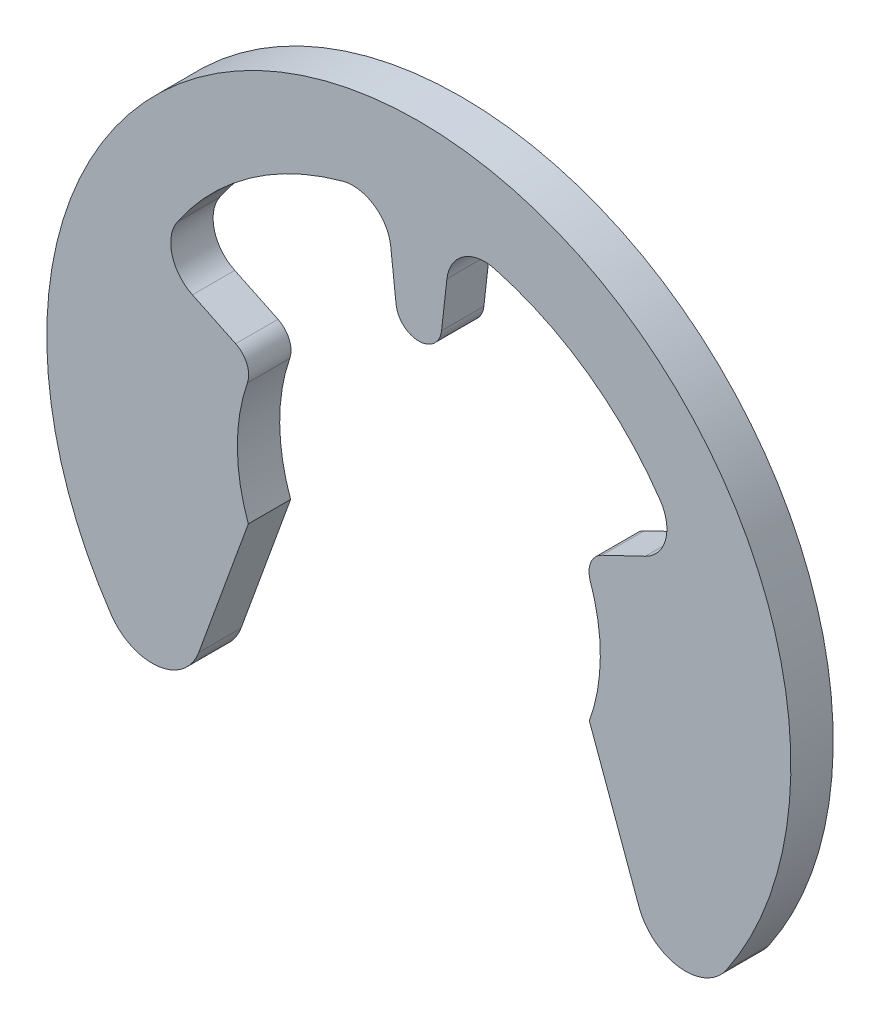
ISO-10303-21;
HEADER;
FILE_DESCRIPTION(('STEP AP214'),'2;1');
FILE_NAME('part.step','',(''),(''),'','','');
FILE_SCHEMA(('AUTOMOTIVE_DESIGN { 1 0 10303 214 1 1 1 1 }'));
ENDSEC;
DATA;
#1=APPLICATION_CONTEXT('core data for automotive mechanical design processes');
#2=APPLICATION_PROTOCOL_DEFINITION('international standard','automotive_design',2000,#1);
#3=PRODUCT_CONTEXT('',#1,'mechanical');
#4=PRODUCT('Part','Part','',(#3));
#5=PRODUCT_RELATED_PRODUCT_CATEGORY('part','',(#4));
#6=PRODUCT_DEFINITION_FORMATION('','',#4);
#7=PRODUCT_DEFINITION_CONTEXT('part definition',#1,'design');
#8=PRODUCT_DEFINITION('design','',#6,#7);
#9=PRODUCT_DEFINITION_SHAPE('','',#8);
#10=(LENGTH_UNIT() NAMED_UNIT(*) SI_UNIT(.MILLI.,.METRE.));
#11=(NAMED_UNIT(*) PLANE_ANGLE_UNIT() SI_UNIT($,.RADIAN.));
#12=(NAMED_UNIT(*) SI_UNIT($,.STERADIAN.) SOLID_ANGLE_UNIT());
#13=UNCERTAINTY_MEASURE_WITH_UNIT(LENGTH_MEASURE(1.E-05),#10,'distance_accuracy_value','');
#14=(GEOMETRIC_REPRESENTATION_CONTEXT(3) GLOBAL_UNCERTAINTY_ASSIGNED_CONTEXT((#13)) GLOBAL_UNIT_ASSIGNED_CONTEXT((#10,
#11,#12)) REPRESENTATION_CONTEXT('',''));
#15=CARTESIAN_POINT('',(0.,0.,0.));
#16=DIRECTION('',(0.,0.,1.));
#17=DIRECTION('',(1.,0.,0.));
#18=AXIS2_PLACEMENT_3D('',#15,#16,#17);
#19=CARTESIAN_POINT('',(0.,0.,0.7));
#20=DIRECTION('',(0.,0.,1.));
#21=DIRECTION('',(1.,0.,0.));
#22=AXIS2_PLACEMENT_3D('',#19,#20,#21);
#23=PLANE('',#22);
#24=DIRECTION('',(-0.342020143325669,-0.939692620785908,0.));
#25=VECTOR('',#24,1.);
#26=CARTESIAN_POINT('',(-2.69420739837844,-0.682981649837103,0.7));
#27=LINE('',#26,#25);
#28=CARTESIAN_POINT('',(-2.81907786235773,-1.02606042997701,0.7));
#29=VERTEX_POINT('',#28);
#30=CARTESIAN_POINT('',(-3.63867386879831,-3.27788195074771,0.7));
#31=VERTEX_POINT('',#30);
#32=EDGE_CURVE('E174',#29,#31,#27,.T.);
#33=ORIENTED_EDGE('',*,*,#32,.F.);
#34=CARTESIAN_POINT('',(0.,0.,0.7));
#35=DIRECTION('',(0.,0.,-1.));
#36=DIRECTION('',(0.81487612668362,-0.579635142275812,0.));
#37=AXIS2_PLACEMENT_3D('',#34,#35,#36);
#38=CIRCLE('',#37,3.);
#39=CARTESIAN_POINT('',(-2.83398503776454,0.984138611033397,0.7));
#40=VERTEX_POINT('',#39);
#41=EDGE_CURVE('E255',#29,#40,#38,.T.);
#42=ORIENTED_EDGE('',*,*,#41,.T.);
#43=CARTESIAN_POINT('',(-3.19106715252287,1.10814007602361,0.7));
#44=DIRECTION('',(0.,0.,1.));
#45=DIRECTION('',(0.81487612668362,0.579635142275812,0.));
#46=AXIS2_PLACEMENT_3D('',#43,#44,#45);
#47=CIRCLE('',#46,0.378);
#48=CARTESIAN_POINT('',(-3.02788681066963,1.44910367530169,0.7));
#49=VERTEX_POINT('',#48);
#50=EDGE_CURVE('E212',#40,#49,#47,.T.);
#51=ORIENTED_EDGE('',*,*,#50,.T.);
#52=DIRECTION('',(-0.902020103910265,0.431694026066745,0.));
#53=VECTOR('',#52,1.);
#54=CARTESIAN_POINT('',(-1.69269281799503,0.810098770888632,0.7));
#55=LINE('',#54,#53);
#56=CARTESIAN_POINT('',(-3.7428844613105,1.79129140825284,0.7));
#57=VERTEX_POINT('',#56);
#58=EDGE_CURVE('E248',#49,#57,#55,.T.);
#59=ORIENTED_EDGE('',*,*,#58,.T.);
#60=CARTESIAN_POINT('',(-3.47091722488845,2.3595640737163,0.7));
#61=DIRECTION('',(0.,0.,-1.));
#62=DIRECTION('',(0.81487612668362,0.579635142275812,0.));
#63=AXIS2_PLACEMENT_3D('',#60,#61,#62);
#64=CIRCLE('',#63,0.63);
#65=CARTESIAN_POINT('',(-3.99192695843139,2.71375167591818,0.7));
#66=VERTEX_POINT('',#65);
#67=EDGE_CURVE('E229',#57,#66,#64,.T.);
#68=ORIENTED_EDGE('',*,*,#67,.T.);
#69=CARTESIAN_POINT('',(0.,0.,0.7));
#70=DIRECTION('',(0.,0.,-1.));
#71=DIRECTION('',(0.81487612668362,0.579635142275812,0.));
#72=AXIS2_PLACEMENT_3D('',#69,#70,#71);
#73=CIRCLE('',#72,4.827);
#74=CARTESIAN_POINT('',(-1.25404073118104,4.6612563590237,0.7));
#75=VERTEX_POINT('',#74);
#76=EDGE_CURVE('E151',#66,#75,#73,.T.);
#77=ORIENTED_EDGE('',*,*,#76,.T.);
#78=CARTESIAN_POINT('',(-1.09036854128171,4.05288853093484,0.7));
#79=DIRECTION('',(0.,0.,-1.));
#80=DIRECTION('',(0.81487612668362,0.579635142275812,0.));
#81=AXIS2_PLACEMENT_3D('',#78,#79,#80);
#82=CIRCLE('',#81,0.63);
#83=CARTESIAN_POINT('',(-0.46432531141737,4.12338586663645,0.7));
#84=VERTEX_POINT('',#83);
#85=EDGE_CURVE('E144',#75,#84,#82,.T.);
#86=ORIENTED_EDGE('',*,*,#85,.T.);
#87=DIRECTION('',(0.11190053285968,-0.993719412483081,0.));
#88=VECTOR('',#87,1.);
#89=CARTESIAN_POINT('',(-0.209987812333993,1.86477186630387,0.7));
#90=LINE('',#89,#88);
#91=CARTESIAN_POINT('',(-0.375625937918604,3.33570159857904,0.7));
#92=VERTEX_POINT('',#91);
#93=EDGE_CURVE('E148',#84,#92,#90,.T.);
#94=ORIENTED_EDGE('',*,*,#93,.T.);
#95=CARTESIAN_POINT('',(0.,3.378,0.7));
#96=DIRECTION('',(0.,0.,1.));
#97=DIRECTION('',(0.81487612668362,-0.579635142275812,0.));
#98=AXIS2_PLACEMENT_3D('',#95,#96,#97);
#99=CIRCLE('',#98,0.378);
#100=CARTESIAN_POINT('',(0.375625937918605,3.33570159857904,0.7));
#101=VERTEX_POINT('',#100);
#102=EDGE_CURVE('E234',#92,#101,#99,.T.);
#103=ORIENTED_EDGE('',*,*,#102,.T.);
#104=DIRECTION('',(0.11190053285968,0.993719412483081,0.));
#105=VECTOR('',#104,1.);
#106=CARTESIAN_POINT('',(0.209987812333994,1.86477186630387,0.7));
#107=LINE('',#106,#105);
#108=CARTESIAN_POINT('',(0.464325311417368,4.12338586663644,0.7));
#109=VERTEX_POINT('',#108);
#110=EDGE_CURVE('E235',#101,#109,#107,.T.);
#111=ORIENTED_EDGE('',*,*,#110,.T.);
#112=CARTESIAN_POINT('',(1.09036854128171,4.05288853093484,0.7));
#113=DIRECTION('',(0.,0.,-1.));
#114=DIRECTION('',(0.81487612668362,-0.579635142275812,0.));
#115=AXIS2_PLACEMENT_3D('',#112,#113,#114);
#116=CIRCLE('',#115,0.63);
#117=CARTESIAN_POINT('',(1.25404073118104,4.6612563590237,0.7));
#118=VERTEX_POINT('',#117);
#119=EDGE_CURVE('E202',#109,#118,#116,.T.);
#120=ORIENTED_EDGE('',*,*,#119,.T.);
#121=CARTESIAN_POINT('',(0.,0.,0.7));
#122=DIRECTION('',(0.,0.,-1.));
#123=DIRECTION('',(0.81487612668362,-0.579635142275812,0.));
#124=AXIS2_PLACEMENT_3D('',#121,#122,#123);
#125=CIRCLE('',#124,4.827);
#126=CARTESIAN_POINT('',(3.99192695843139,2.71375167591818,0.7));
#127=VERTEX_POINT('',#126);
#128=EDGE_CURVE('E189',#118,#127,#125,.T.);
#129=ORIENTED_EDGE('',*,*,#128,.T.);
#130=CARTESIAN_POINT('',(3.47091722488845,2.3595640737163,0.7));
#131=DIRECTION('',(0.,0.,-1.));
#132=DIRECTION('',(0.81487612668362,-0.579635142275812,0.));
#133=AXIS2_PLACEMENT_3D('',#130,#131,#132);
#134=CIRCLE('',#133,0.63);
#135=CARTESIAN_POINT('',(3.7428844613105,1.79129140825284,0.7));
#136=VERTEX_POINT('',#135);
#137=EDGE_CURVE('E190',#127,#136,#134,.T.);
#138=ORIENTED_EDGE('',*,*,#137,.T.);
#139=DIRECTION('',(-0.902020103910264,-0.431694026066746,0.));
#140=VECTOR('',#139,1.);
#141=CARTESIAN_POINT('',(1.69269281799503,0.810098770888631,0.7));
#142=LINE('',#141,#140);
#143=CARTESIAN_POINT('',(3.02788681066963,1.44910367530169,0.7));
#144=VERTEX_POINT('',#143);
#145=EDGE_CURVE('E223',#136,#144,#142,.T.);
#146=ORIENTED_EDGE('',*,*,#145,.T.);
#147=CARTESIAN_POINT('',(3.19106715252287,1.10814007602361,0.7));
#148=DIRECTION('',(0.,0.,1.));
#149=DIRECTION('',(0.81487612668362,-0.579635142275812,0.));
#150=AXIS2_PLACEMENT_3D('',#147,#148,#149);
#151=CIRCLE('',#150,0.378);
#152=CARTESIAN_POINT('',(2.83398503776454,0.984138611033398,0.7));
#153=VERTEX_POINT('',#152);
#154=EDGE_CURVE('E27',#144,#153,#151,.T.);
#155=ORIENTED_EDGE('',*,*,#154,.T.);
#156=CARTESIAN_POINT('',(0.,0.,0.7));
#157=DIRECTION('',(0.,0.,-1.));
#158=DIRECTION('',(0.81487612668362,-0.579635142275812,0.));
#159=AXIS2_PLACEMENT_3D('',#156,#157,#158);
#160=CIRCLE('',#159,3.);
#161=CARTESIAN_POINT('',(2.81907786235773,-1.026060429977,0.7));
#162=VERTEX_POINT('',#161);
#163=EDGE_CURVE('E240',#153,#162,#160,.T.);
#164=ORIENTED_EDGE('',*,*,#163,.T.);
#165=DIRECTION('',(-0.342020143325669,0.939692620785908,0.));
#166=VECTOR('',#165,1.);
#167=CARTESIAN_POINT('',(2.69420739837844,-0.682981649837102,0.7));
#168=LINE('',#167,#166);
#169=CARTESIAN_POINT('',(3.63867386879831,-3.27788195074771,0.7));
#170=VERTEX_POINT('',#169);
#171=EDGE_CURVE('E127',#170,#162,#168,.T.);
#172=ORIENTED_EDGE('',*,*,#171,.F.);
#173=CARTESIAN_POINT('',(4.40828212522197,-2.99776745336399,0.7));
#174=DIRECTION('',(0.,0.,-1.));
#175=DIRECTION('',(1.,0.,0.));
#176=AXIS2_PLACEMENT_3D('',#173,#174,#175);
#177=CIRCLE('',#176,0.819);
#178=CARTESIAN_POINT('',(5.08552524294038,-3.45831360686336,0.7));
#179=VERTEX_POINT('',#178);
#180=EDGE_CURVE('E219',#179,#170,#177,.T.);
#181=ORIENTED_EDGE('',*,*,#180,.F.);
#182=CARTESIAN_POINT('',(0.,0.,0.7));
#183=DIRECTION('',(0.,0.,1.));
#184=DIRECTION('',(1.,0.,0.));
#185=AXIS2_PLACEMENT_3D('',#182,#183,#184);
#186=CIRCLE('',#185,6.15);
#187=CARTESIAN_POINT('',(-5.08552524294038,-3.45831360686336,0.7));
#188=VERTEX_POINT('',#187);
#189=EDGE_CURVE('E11',#179,#188,#186,.T.);
#190=ORIENTED_EDGE('',*,*,#189,.T.);
#191=CARTESIAN_POINT('',(-4.40828212522197,-2.99776745336399,0.7));
#192=DIRECTION('',(0.,0.,-1.));
#193=DIRECTION('',(1.,0.,0.));
#194=AXIS2_PLACEMENT_3D('',#191,#192,#193);
#195=CIRCLE('',#194,0.819);
#196=EDGE_CURVE('E197',#31,#188,#195,.T.);
#197=ORIENTED_EDGE('',*,*,#196,.F.);
#198=EDGE_LOOP('',(#33,#42,#51,#59,#68,#77,#86,#94,#103,#111,#120,#129,#138,#146,#155,#164,#172,
#181,#190,#197));
#199=FACE_BOUND('',#198,.T.);
#200=ADVANCED_FACE('F17',(#199),#23,.T.);
#201=CARTESIAN_POINT('',(0.,0.,0.35));
#202=DIRECTION('',(0.,0.,-1.));
#203=DIRECTION('',(1.,0.,0.));
#204=AXIS2_PLACEMENT_3D('',#201,#202,#203);
#205=CYLINDRICAL_SURFACE('',#204,6.15);
#206=DIRECTION('',(0.,0.,1.));
#207=VECTOR('',#206,1.);
#208=CARTESIAN_POINT('',(-5.08552524294038,-3.45831360686336,-0.7));
#209=LINE('',#208,#207);
#210=CARTESIAN_POINT('',(-5.08552524294038,-3.45831360686336,0.));
#211=VERTEX_POINT('',#210);
#212=EDGE_CURVE('E199',#211,#188,#209,.T.);
#213=ORIENTED_EDGE('',*,*,#212,.T.);
#214=ORIENTED_EDGE('',*,*,#189,.F.);
#215=DIRECTION('',(0.,0.,1.));
#216=VECTOR('',#215,1.);
#217=CARTESIAN_POINT('',(5.08552524294038,-3.45831360686336,-0.7));
#218=LINE('',#217,#216);
#219=CARTESIAN_POINT('',(5.08552524294038,-3.45831360686336,0.));
#220=VERTEX_POINT('',#219);
#221=EDGE_CURVE('E208',#220,#179,#218,.T.);
#222=ORIENTED_EDGE('',*,*,#221,.F.);
#223=CARTESIAN_POINT('',(0.,0.,0.));
#224=DIRECTION('',(0.,0.,-1.));
#225=DIRECTION('',(1.,0.,0.));
#226=AXIS2_PLACEMENT_3D('',#223,#224,#225);
#227=CIRCLE('',#226,6.15);
#228=EDGE_CURVE('E258',#211,#220,#227,.T.);
#229=ORIENTED_EDGE('',*,*,#228,.F.);
#230=EDGE_LOOP('',(#213,#214,#222,#229));
#231=FACE_BOUND('',#230,.T.);
#232=ADVANCED_FACE('F361',(#231),#205,.T.);
#233=CARTESIAN_POINT('',(3.19106715252287,1.10814007602361,-0.7));
#234=DIRECTION('',(0.,0.,-1.));
#235=DIRECTION('',(0.81487612668362,-0.579635142275812,0.));
#236=AXIS2_PLACEMENT_3D('',#233,#234,#235);
#237=CYLINDRICAL_SURFACE('',#236,0.378);
#238=CARTESIAN_POINT('',(3.19106715252287,1.10814007602361,0.));
#239=DIRECTION('',(0.,0.,-1.));
#240=DIRECTION('',(0.81487612668362,-0.579635142275812,0.));
#241=AXIS2_PLACEMENT_3D('',#238,#239,#240);
#242=CIRCLE('',#241,0.378);
#243=CARTESIAN_POINT('',(2.83398503776454,0.984138611033398,0.));
#244=VERTEX_POINT('',#243);
#245=CARTESIAN_POINT('',(3.02788681066963,1.44910367530169,0.));
#246=VERTEX_POINT('',#245);
#247=EDGE_CURVE('E266',#244,#246,#242,.T.);
#248=ORIENTED_EDGE('',*,*,#247,.F.);
#249=DIRECTION('',(0.,0.,1.));
#250=VECTOR('',#249,1.);
#251=CARTESIAN_POINT('',(2.83398503776454,0.984138611033398,-0.7));
#252=LINE('',#251,#250);
#253=EDGE_CURVE('E242',#244,#153,#252,.T.);
#254=ORIENTED_EDGE('',*,*,#253,.T.);
#255=ORIENTED_EDGE('',*,*,#154,.F.);
#256=DIRECTION('',(0.,0.,1.));
#257=VECTOR('',#256,1.);
#258=CARTESIAN_POINT('',(3.02788681066963,1.44910367530169,-0.7));
#259=LINE('',#258,#257);
#260=EDGE_CURVE('E225',#246,#144,#259,.T.);
#261=ORIENTED_EDGE('',*,*,#260,.F.);
#262=EDGE_LOOP('',(#248,#254,#255,#261));
#263=FACE_BOUND('',#262,.T.);
#264=ADVANCED_FACE('F388',(#263),#237,.T.);
#265=CARTESIAN_POINT('',(3.38538563599007,1.62019754177726,-0.7));
#266=DIRECTION('',(0.431694026066746,-0.902020103910264,0.));
#267=DIRECTION('',(0.902020103910264,0.431694026066746,0.));
#268=AXIS2_PLACEMENT_3D('',#265,#266,#267);
#269=PLANE('',#268);
#270=DIRECTION('',(0.902020103910264,0.431694026066746,0.));
#271=VECTOR('',#270,1.);
#272=CARTESIAN_POINT('',(1.69269281799503,0.810098770888631,0.));
#273=LINE('',#272,#271);
#274=CARTESIAN_POINT('',(3.7428844613105,1.79129140825284,0.));
#275=VERTEX_POINT('',#274);
#276=EDGE_CURVE('E262',#246,#275,#273,.T.);
#277=ORIENTED_EDGE('',*,*,#276,.F.);
#278=ORIENTED_EDGE('',*,*,#260,.T.);
#279=ORIENTED_EDGE('',*,*,#145,.F.);
#280=DIRECTION('',(0.,0.,1.));
#281=VECTOR('',#280,1.);
#282=CARTESIAN_POINT('',(3.7428844613105,1.79129140825284,-0.7));
#283=LINE('',#282,#281);
#284=EDGE_CURVE('E215',#275,#136,#283,.T.);
#285=ORIENTED_EDGE('',*,*,#284,.F.);
#286=EDGE_LOOP('',(#277,#278,#279,#285));
#287=FACE_BOUND('',#286,.T.);
#288=ADVANCED_FACE('F415',(#287),#269,.F.);
#289=CARTESIAN_POINT('',(0.,3.378,-0.7));
#290=DIRECTION('',(0.,0.,-1.));
#291=DIRECTION('',(0.81487612668362,-0.579635142275812,0.));
#292=AXIS2_PLACEMENT_3D('',#289,#290,#291);
#293=CYLINDRICAL_SURFACE('',#292,0.378);
#294=CARTESIAN_POINT('',(0.,3.378,0.));
#295=DIRECTION('',(0.,0.,-1.));
#296=DIRECTION('',(0.81487612668362,-0.579635142275812,0.));
#297=AXIS2_PLACEMENT_3D('',#294,#295,#296);
#298=CIRCLE('',#297,0.378);
#299=CARTESIAN_POINT('',(0.375625937918605,3.33570159857904,0.));
#300=VERTEX_POINT('',#299);
#301=CARTESIAN_POINT('',(-0.375625937918604,3.33570159857904,0.));
#302=VERTEX_POINT('',#301);
#303=EDGE_CURVE('E209',#300,#302,#298,.T.);
#304=ORIENTED_EDGE('',*,*,#303,.F.);
#305=DIRECTION('',(0.,0.,1.));
#306=VECTOR('',#305,1.);
#307=CARTESIAN_POINT('',(0.375625937918605,3.33570159857904,-0.7));
#308=LINE('',#307,#306);
#309=EDGE_CURVE('E231',#300,#101,#308,.T.);
#310=ORIENTED_EDGE('',*,*,#309,.T.);
#311=ORIENTED_EDGE('',*,*,#102,.F.);
#312=DIRECTION('',(0.,0.,1.));
#313=VECTOR('',#312,1.);
#314=CARTESIAN_POINT('',(-0.375625937918604,3.33570159857904,-0.7));
#315=LINE('',#314,#313);
#316=EDGE_CURVE('E168',#302,#92,#315,.T.);
#317=ORIENTED_EDGE('',*,*,#316,.F.);
#318=EDGE_LOOP('',(#304,#310,#311,#317));
#319=FACE_BOUND('',#318,.T.);
#320=ADVANCED_FACE('F414',(#319),#293,.T.);
#321=CARTESIAN_POINT('',(0.419975624667987,3.72954373260774,-0.7));
#322=DIRECTION('',(-0.993719412483081,0.11190053285968,0.));
#323=DIRECTION('',(-0.11190053285968,-0.993719412483081,0.));
#324=AXIS2_PLACEMENT_3D('',#321,#322,#323);
#325=PLANE('',#324);
#326=DIRECTION('',(-0.11190053285968,-0.993719412483081,0.));
#327=VECTOR('',#326,1.);
#328=CARTESIAN_POINT('',(0.209987812333994,1.86477186630387,0.));
#329=LINE('',#328,#327);
#330=CARTESIAN_POINT('',(0.464325311417368,4.12338586663644,0.));
#331=VERTEX_POINT('',#330);
#332=EDGE_CURVE('E181',#331,#300,#329,.T.);
#333=ORIENTED_EDGE('',*,*,#332,.F.);
#334=DIRECTION('',(0.,0.,1.));
#335=VECTOR('',#334,1.);
#336=CARTESIAN_POINT('',(0.464325311417368,4.12338586663644,-0.7));
#337=LINE('',#336,#335);
#338=EDGE_CURVE('E204',#331,#109,#337,.T.);
#339=ORIENTED_EDGE('',*,*,#338,.T.);
#340=ORIENTED_EDGE('',*,*,#110,.F.);
#341=ORIENTED_EDGE('',*,*,#309,.F.);
#342=EDGE_LOOP('',(#333,#339,#340,#341));
#343=FACE_BOUND('',#342,.T.);
#344=ADVANCED_FACE('F327',(#343),#325,.F.);
#345=CARTESIAN_POINT('',(1.09036854128171,4.05288853093484,-0.7));
#346=DIRECTION('',(0.,0.,-1.));
#347=DIRECTION('',(0.81487612668362,-0.579635142275812,0.));
#348=AXIS2_PLACEMENT_3D('',#345,#346,#347);
#349=CYLINDRICAL_SURFACE('',#348,0.63);
#350=CARTESIAN_POINT('',(1.09036854128171,4.05288853093484,0.));
#351=DIRECTION('',(0.,0.,1.));
#352=DIRECTION('',(0.81487612668362,-0.579635142275812,0.));
#353=AXIS2_PLACEMENT_3D('',#350,#351,#352);
#354=CIRCLE('',#353,0.63);
#355=CARTESIAN_POINT('',(1.25404073118104,4.6612563590237,0.));
#356=VERTEX_POINT('',#355);
#357=EDGE_CURVE('E178',#356,#331,#354,.T.);
#358=ORIENTED_EDGE('',*,*,#357,.F.);
#359=DIRECTION('',(0.,0.,1.));
#360=VECTOR('',#359,1.);
#361=CARTESIAN_POINT('',(1.25404073118104,4.6612563590237,-0.7));
#362=LINE('',#361,#360);
#363=EDGE_CURVE('E205',#356,#118,#362,.T.);
#364=ORIENTED_EDGE('',*,*,#363,.T.);
#365=ORIENTED_EDGE('',*,*,#119,.F.);
#366=ORIENTED_EDGE('',*,*,#338,.F.);
#367=EDGE_LOOP('',(#358,#364,#365,#366));
#368=FACE_BOUND('',#367,.T.);
#369=ADVANCED_FACE('F331',(#368),#349,.F.);
#370=CARTESIAN_POINT('',(0.,0.,-0.7));
#371=DIRECTION('',(0.,0.,-1.));
#372=DIRECTION('',(0.81487612668362,-0.579635142275812,0.));
#373=AXIS2_PLACEMENT_3D('',#370,#371,#372);
#374=CYLINDRICAL_SURFACE('',#373,4.827);
#375=CARTESIAN_POINT('',(0.,0.,0.));
#376=DIRECTION('',(0.,0.,1.));
#377=DIRECTION('',(0.81487612668362,-0.579635142275812,0.));
#378=AXIS2_PLACEMENT_3D('',#375,#376,#377);
#379=CIRCLE('',#378,4.827);
#380=CARTESIAN_POINT('',(3.99192695843139,2.71375167591818,0.));
#381=VERTEX_POINT('',#380);
#382=EDGE_CURVE('E182',#381,#356,#379,.T.);
#383=ORIENTED_EDGE('',*,*,#382,.F.);
#384=DIRECTION('',(0.,0.,1.));
#385=VECTOR('',#384,1.);
#386=CARTESIAN_POINT('',(3.99192695843139,2.71375167591818,-0.7));
#387=LINE('',#386,#385);
#388=EDGE_CURVE('E186',#381,#127,#387,.T.);
#389=ORIENTED_EDGE('',*,*,#388,.T.);
#390=ORIENTED_EDGE('',*,*,#128,.F.);
#391=ORIENTED_EDGE('',*,*,#363,.F.);
#392=EDGE_LOOP('',(#383,#389,#390,#391));
#393=FACE_BOUND('',#392,.T.);
#394=ADVANCED_FACE('F336',(#393),#374,.F.);
#395=CARTESIAN_POINT('',(3.47091722488845,2.3595640737163,-0.7));
#396=DIRECTION('',(0.,0.,-1.));
#397=DIRECTION('',(0.81487612668362,-0.579635142275812,0.));
#398=AXIS2_PLACEMENT_3D('',#395,#396,#397);
#399=CYLINDRICAL_SURFACE('',#398,0.63);
#400=CARTESIAN_POINT('',(3.47091722488845,2.3595640737163,0.));
#401=DIRECTION('',(0.,0.,1.));
#402=DIRECTION('',(0.81487612668362,-0.579635142275812,0.));
#403=AXIS2_PLACEMENT_3D('',#400,#401,#402);
#404=CIRCLE('',#403,0.63);
#405=EDGE_CURVE('E265',#275,#381,#404,.T.);
#406=ORIENTED_EDGE('',*,*,#405,.F.);
#407=ORIENTED_EDGE('',*,*,#284,.T.);
#408=ORIENTED_EDGE('',*,*,#137,.F.);
#409=ORIENTED_EDGE('',*,*,#388,.F.);
#410=EDGE_LOOP('',(#406,#407,#408,#409));
#411=FACE_BOUND('',#410,.T.);
#412=ADVANCED_FACE('F344',(#411),#399,.F.);
#413=CARTESIAN_POINT('',(-3.19106715252287,1.10814007602361,-0.7));
#414=DIRECTION('',(0.,0.,-1.));
#415=DIRECTION('',(0.81487612668362,0.579635142275812,0.));
#416=AXIS2_PLACEMENT_3D('',#413,#414,#415);
#417=CYLINDRICAL_SURFACE('',#416,0.378);
#418=CARTESIAN_POINT('',(-3.19106715252287,1.10814007602361,0.));
#419=DIRECTION('',(0.,0.,-1.));
#420=DIRECTION('',(0.81487612668362,0.579635142275812,0.));
#421=AXIS2_PLACEMENT_3D('',#418,#419,#420);
#422=CIRCLE('',#421,0.378);
#423=CARTESIAN_POINT('',(-3.02788681066963,1.44910367530169,0.));
#424=VERTEX_POINT('',#423);
#425=CARTESIAN_POINT('',(-2.83398503776454,0.984138611033397,0.));
#426=VERTEX_POINT('',#425);
#427=EDGE_CURVE('E170',#424,#426,#422,.T.);
#428=ORIENTED_EDGE('',*,*,#427,.F.);
#429=DIRECTION('',(0.,0.,1.));
#430=VECTOR('',#429,1.);
#431=CARTESIAN_POINT('',(-3.02788681066963,1.44910367530169,-0.7));
#432=LINE('',#431,#430);
#433=EDGE_CURVE('E21',#424,#49,#432,.T.);
#434=ORIENTED_EDGE('',*,*,#433,.T.);
#435=ORIENTED_EDGE('',*,*,#50,.F.);
#436=DIRECTION('',(0.,0.,1.));
#437=VECTOR('',#436,1.);
#438=CARTESIAN_POINT('',(-2.83398503776454,0.984138611033398,-0.7));
#439=LINE('',#438,#437);
#440=EDGE_CURVE('E222',#426,#40,#439,.T.);
#441=ORIENTED_EDGE('',*,*,#440,.F.);
#442=EDGE_LOOP('',(#428,#434,#435,#441));
#443=FACE_BOUND('',#442,.T.);
#444=ADVANCED_FACE('F297',(#443),#417,.T.);
#445=CARTESIAN_POINT('',(-3.38538563599007,1.62019754177727,-0.7));
#446=DIRECTION('',(-0.431694026066745,-0.902020103910265,0.));
#447=DIRECTION('',(0.902020103910265,-0.431694026066745,0.));
#448=AXIS2_PLACEMENT_3D('',#445,#446,#447);
#449=PLANE('',#448);
#450=DIRECTION('',(0.902020103910265,-0.431694026066745,0.));
#451=VECTOR('',#450,1.);
#452=CARTESIAN_POINT('',(-1.69269281799503,0.810098770888632,0.));
#453=LINE('',#452,#451);
#454=CARTESIAN_POINT('',(-3.7428844613105,1.79129140825284,0.));
#455=VERTEX_POINT('',#454);
#456=EDGE_CURVE('E185',#455,#424,#453,.T.);
#457=ORIENTED_EDGE('',*,*,#456,.F.);
#458=DIRECTION('',(0.,0.,1.));
#459=VECTOR('',#458,1.);
#460=CARTESIAN_POINT('',(-3.7428844613105,1.79129140825284,-0.7));
#461=LINE('',#460,#459);
#462=EDGE_CURVE('E245',#455,#57,#461,.T.);
#463=ORIENTED_EDGE('',*,*,#462,.T.);
#464=ORIENTED_EDGE('',*,*,#58,.F.);
#465=ORIENTED_EDGE('',*,*,#433,.F.);
#466=EDGE_LOOP('',(#457,#463,#464,#465));
#467=FACE_BOUND('',#466,.T.);
#468=ADVANCED_FACE('F292',(#467),#449,.F.);
#469=CARTESIAN_POINT('',(-3.47091722488845,2.3595640737163,-0.7));
#470=DIRECTION('',(0.,0.,-1.));
#471=DIRECTION('',(0.81487612668362,0.579635142275812,0.));
#472=AXIS2_PLACEMENT_3D('',#469,#470,#471);
#473=CYLINDRICAL_SURFACE('',#472,0.63);
#474=CARTESIAN_POINT('',(-3.47091722488845,2.3595640737163,0.));
#475=DIRECTION('',(0.,0.,1.));
#476=DIRECTION('',(0.81487612668362,0.579635142275812,0.));
#477=AXIS2_PLACEMENT_3D('',#474,#475,#476);
#478=CIRCLE('',#477,0.63);
#479=CARTESIAN_POINT('',(-3.99192695843139,2.71375167591818,0.));
#480=VERTEX_POINT('',#479);
#481=EDGE_CURVE('E260',#480,#455,#478,.T.);
#482=ORIENTED_EDGE('',*,*,#481,.F.);
#483=DIRECTION('',(0.,0.,1.));
#484=VECTOR('',#483,1.);
#485=CARTESIAN_POINT('',(-3.99192695843139,2.71375167591818,-0.7));
#486=LINE('',#485,#484);
#487=EDGE_CURVE('E226',#480,#66,#486,.T.);
#488=ORIENTED_EDGE('',*,*,#487,.T.);
#489=ORIENTED_EDGE('',*,*,#67,.F.);
#490=ORIENTED_EDGE('',*,*,#462,.F.);
#491=EDGE_LOOP('',(#482,#488,#489,#490));
#492=FACE_BOUND('',#491,.T.);
#493=ADVANCED_FACE('F368',(#492),#473,.F.);
#494=CARTESIAN_POINT('',(0.,0.,-0.7));
#495=DIRECTION('',(0.,0.,-1.));
#496=DIRECTION('',(0.81487612668362,0.579635142275812,0.));
#497=AXIS2_PLACEMENT_3D('',#494,#495,#496);
#498=CYLINDRICAL_SURFACE('',#497,4.827);
#499=CARTESIAN_POINT('',(0.,0.,0.));
#500=DIRECTION('',(0.,0.,1.));
#501=DIRECTION('',(0.81487612668362,0.579635142275812,0.));
#502=AXIS2_PLACEMENT_3D('',#499,#500,#501);
#503=CIRCLE('',#502,4.827);
#504=CARTESIAN_POINT('',(-1.25404073118104,4.6612563590237,0.));
#505=VERTEX_POINT('',#504);
#506=EDGE_CURVE('E195',#505,#480,#503,.T.);
#507=ORIENTED_EDGE('',*,*,#506,.F.);
#508=DIRECTION('',(0.,0.,1.));
#509=VECTOR('',#508,1.);
#510=CARTESIAN_POINT('',(-1.25404073118104,4.6612563590237,-0.7));
#511=LINE('',#510,#509);
#512=EDGE_CURVE('E155',#505,#75,#511,.T.);
#513=ORIENTED_EDGE('',*,*,#512,.T.);
#514=ORIENTED_EDGE('',*,*,#76,.F.);
#515=ORIENTED_EDGE('',*,*,#487,.F.);
#516=EDGE_LOOP('',(#507,#513,#514,#515));
#517=FACE_BOUND('',#516,.T.);
#518=ADVANCED_FACE('F371',(#517),#498,.F.);
#519=CARTESIAN_POINT('',(-1.09036854128171,4.05288853093484,-0.7));
#520=DIRECTION('',(0.,0.,-1.));
#521=DIRECTION('',(0.81487612668362,0.579635142275812,0.));
#522=AXIS2_PLACEMENT_3D('',#519,#520,#521);
#523=CYLINDRICAL_SURFACE('',#522,0.63);
#524=CARTESIAN_POINT('',(-1.09036854128171,4.05288853093484,0.));
#525=DIRECTION('',(0.,0.,1.));
#526=DIRECTION('',(0.81487612668362,0.579635142275812,0.));
#527=AXIS2_PLACEMENT_3D('',#524,#525,#526);
#528=CIRCLE('',#527,0.63);
#529=CARTESIAN_POINT('',(-0.46432531141737,4.12338586663645,0.));
#530=VERTEX_POINT('',#529);
#531=EDGE_CURVE('E161',#530,#505,#528,.T.);
#532=ORIENTED_EDGE('',*,*,#531,.F.);
#533=DIRECTION('',(0.,0.,1.));
#534=VECTOR('',#533,1.);
#535=CARTESIAN_POINT('',(-0.46432531141737,4.12338586663645,-0.7));
#536=LINE('',#535,#534);
#537=EDGE_CURVE('E156',#530,#84,#536,.T.);
#538=ORIENTED_EDGE('',*,*,#537,.T.);
#539=ORIENTED_EDGE('',*,*,#85,.F.);
#540=ORIENTED_EDGE('',*,*,#512,.F.);
#541=EDGE_LOOP('',(#532,#538,#539,#540));
#542=FACE_BOUND('',#541,.T.);
#543=ADVANCED_FACE('F159',(#542),#523,.F.);
#544=CARTESIAN_POINT('',(-0.419975624667987,3.72954373260774,-0.7));
#545=DIRECTION('',(0.993719412483081,0.11190053285968,0.));
#546=DIRECTION('',(-0.11190053285968,0.993719412483081,0.));
#547=AXIS2_PLACEMENT_3D('',#544,#545,#546);
#548=PLANE('',#547);
#549=DIRECTION('',(-0.11190053285968,0.993719412483081,0.));
#550=VECTOR('',#549,1.);
#551=CARTESIAN_POINT('',(-0.209987812333993,1.86477186630387,0.));
#552=LINE('',#551,#550);
#553=EDGE_CURVE('E196',#302,#530,#552,.T.);
#554=ORIENTED_EDGE('',*,*,#553,.F.);
#555=ORIENTED_EDGE('',*,*,#316,.T.);
#556=ORIENTED_EDGE('',*,*,#93,.F.);
#557=ORIENTED_EDGE('',*,*,#537,.F.);
#558=EDGE_LOOP('',(#554,#555,#556,#557));
#559=FACE_BOUND('',#558,.T.);
#560=ADVANCED_FACE('F166',(#559),#548,.F.);
#561=CARTESIAN_POINT('',(0.,0.,0.));
#562=DIRECTION('',(0.,0.,-1.));
#563=DIRECTION('',(-1.,0.,0.));
#564=AXIS2_PLACEMENT_3D('',#561,#562,#563);
#565=PLANE('',#564);
#566=DIRECTION('',(0.342020143325669,0.939692620785908,0.));
#567=VECTOR('',#566,1.);
#568=CARTESIAN_POINT('',(-2.69420739837844,-0.682981649837103,0.));
#569=LINE('',#568,#567);
#570=CARTESIAN_POINT('',(-3.63867386879831,-3.27788195074771,0.));
#571=VERTEX_POINT('',#570);
#572=CARTESIAN_POINT('',(-2.81907786235773,-1.02606042997701,0.));
#573=VERTEX_POINT('',#572);
#574=EDGE_CURVE('E193',#571,#573,#569,.T.);
#575=ORIENTED_EDGE('',*,*,#574,.F.);
#576=CARTESIAN_POINT('',(-4.40828212522197,-2.99776745336399,0.));
#577=DIRECTION('',(0.,0.,1.));
#578=DIRECTION('',(1.,0.,0.));
#579=AXIS2_PLACEMENT_3D('',#576,#577,#578);
#580=CIRCLE('',#579,0.819);
#581=EDGE_CURVE('E267',#211,#571,#580,.T.);
#582=ORIENTED_EDGE('',*,*,#581,.F.);
#583=ORIENTED_EDGE('',*,*,#228,.T.);
#584=CARTESIAN_POINT('',(4.40828212522197,-2.99776745336399,0.));
#585=DIRECTION('',(0.,0.,1.));
#586=DIRECTION('',(1.,0.,0.));
#587=AXIS2_PLACEMENT_3D('',#584,#585,#586);
#588=CIRCLE('',#587,0.819);
#589=CARTESIAN_POINT('',(3.63867386879831,-3.27788195074771,0.));
#590=VERTEX_POINT('',#589);
#591=EDGE_CURVE('E218',#590,#220,#588,.T.);
#592=ORIENTED_EDGE('',*,*,#591,.F.);
#593=DIRECTION('',(0.342020143325669,-0.939692620785908,0.));
#594=VECTOR('',#593,1.);
#595=CARTESIAN_POINT('',(2.69420739837844,-0.682981649837102,0.));
#596=LINE('',#595,#594);
#597=CARTESIAN_POINT('',(2.81907786235773,-1.02606042997701,0.));
#598=VERTEX_POINT('',#597);
#599=EDGE_CURVE('E243',#598,#590,#596,.T.);
#600=ORIENTED_EDGE('',*,*,#599,.F.);
#601=CARTESIAN_POINT('',(0.,0.,0.));
#602=DIRECTION('',(0.,0.,1.));
#603=DIRECTION('',(0.81487612668362,-0.579635142275812,0.));
#604=AXIS2_PLACEMENT_3D('',#601,#602,#603);
#605=CIRCLE('',#604,3.);
#606=EDGE_CURVE('E108',#598,#244,#605,.T.);
#607=ORIENTED_EDGE('',*,*,#606,.T.);
#608=ORIENTED_EDGE('',*,*,#247,.T.);
#609=ORIENTED_EDGE('',*,*,#276,.T.);
#610=ORIENTED_EDGE('',*,*,#405,.T.);
#611=ORIENTED_EDGE('',*,*,#382,.T.);
#612=ORIENTED_EDGE('',*,*,#357,.T.);
#613=ORIENTED_EDGE('',*,*,#332,.T.);
#614=ORIENTED_EDGE('',*,*,#303,.T.);
#615=ORIENTED_EDGE('',*,*,#553,.T.);
#616=ORIENTED_EDGE('',*,*,#531,.T.);
#617=ORIENTED_EDGE('',*,*,#506,.T.);
#618=ORIENTED_EDGE('',*,*,#481,.T.);
#619=ORIENTED_EDGE('',*,*,#456,.T.);
#620=ORIENTED_EDGE('',*,*,#427,.T.);
#621=CARTESIAN_POINT('',(0.,0.,0.));
#622=DIRECTION('',(0.,0.,1.));
#623=DIRECTION('',(0.81487612668362,-0.579635142275812,0.));
#624=AXIS2_PLACEMENT_3D('',#621,#622,#623);
#625=CIRCLE('',#624,3.);
#626=EDGE_CURVE('E220',#426,#573,#625,.T.);
#627=ORIENTED_EDGE('',*,*,#626,.T.);
#628=EDGE_LOOP('',(#575,#582,#583,#592,#600,#607,#608,#609,#610,#611,#612,#613,#614,#615,#616,
#617,#618,#619,#620,#627));
#629=FACE_BOUND('',#628,.T.);
#630=ADVANCED_FACE('F285',(#629),#565,.T.);
#631=CARTESIAN_POINT('',(0.,0.,-0.7));
#632=DIRECTION('',(0.,0.,-1.));
#633=DIRECTION('',(0.81487612668362,-0.579635142275812,0.));
#634=AXIS2_PLACEMENT_3D('',#631,#632,#633);
#635=CYLINDRICAL_SURFACE('',#634,3.);
#636=DIRECTION('',(0.,0.,1.));
#637=VECTOR('',#636,1.);
#638=CARTESIAN_POINT('',(-2.81907786235773,-1.02606042997701,0.35));
#639=LINE('',#638,#637);
#640=EDGE_CURVE('E200',#573,#29,#639,.T.);
#641=ORIENTED_EDGE('',*,*,#640,.F.);
#642=ORIENTED_EDGE('',*,*,#626,.F.);
#643=ORIENTED_EDGE('',*,*,#440,.T.);
#644=ORIENTED_EDGE('',*,*,#41,.F.);
#645=EDGE_LOOP('',(#641,#642,#643,#644));
#646=FACE_BOUND('',#645,.T.);
#647=ADVANCED_FACE('F303',(#646),#635,.F.);
#648=CARTESIAN_POINT('',(0.,0.,-0.7));
#649=DIRECTION('',(0.,0.,-1.));
#650=DIRECTION('',(0.81487612668362,-0.579635142275812,0.));
#651=AXIS2_PLACEMENT_3D('',#648,#649,#650);
#652=CYLINDRICAL_SURFACE('',#651,3.);
#653=DIRECTION('',(0.,0.,-1.));
#654=VECTOR('',#653,1.);
#655=CARTESIAN_POINT('',(2.81907786235773,-1.026060429977,0.35));
#656=LINE('',#655,#654);
#657=EDGE_CURVE('E207',#162,#598,#656,.T.);
#658=ORIENTED_EDGE('',*,*,#657,.F.);
#659=ORIENTED_EDGE('',*,*,#163,.F.);
#660=ORIENTED_EDGE('',*,*,#253,.F.);
#661=ORIENTED_EDGE('',*,*,#606,.F.);
#662=EDGE_LOOP('',(#658,#659,#660,#661));
#663=FACE_BOUND('',#662,.T.);
#664=ADVANCED_FACE('F394',(#663),#652,.F.);
#665=CARTESIAN_POINT('',(3.22887586557802,-2.15197119036236,-0.7));
#666=DIRECTION('',(-0.939692620785908,-0.342020143325669,0.));
#667=DIRECTION('',(0.342020143325669,-0.939692620785908,0.));
#668=AXIS2_PLACEMENT_3D('',#665,#666,#667);
#669=PLANE('',#668);
#670=ORIENTED_EDGE('',*,*,#171,.T.);
#671=ORIENTED_EDGE('',*,*,#657,.T.);
#672=ORIENTED_EDGE('',*,*,#599,.T.);
#673=DIRECTION('',(0.,0.,1.));
#674=VECTOR('',#673,1.);
#675=CARTESIAN_POINT('',(3.63867386879831,-3.27788195074771,-0.7));
#676=LINE('',#675,#674);
#677=EDGE_CURVE('E216',#590,#170,#676,.T.);
#678=ORIENTED_EDGE('',*,*,#677,.T.);
#679=EDGE_LOOP('',(#670,#671,#672,#678));
#680=FACE_BOUND('',#679,.T.);
#681=ADVANCED_FACE('F391',(#680),#669,.T.);
#682=CARTESIAN_POINT('',(4.40828212522197,-2.99776745336399,-0.7));
#683=DIRECTION('',(0.,0.,-1.));
#684=DIRECTION('',(1.,0.,0.));
#685=AXIS2_PLACEMENT_3D('',#682,#683,#684);
#686=CYLINDRICAL_SURFACE('',#685,0.819);
#687=ORIENTED_EDGE('',*,*,#180,.T.);
#688=ORIENTED_EDGE('',*,*,#677,.F.);
#689=ORIENTED_EDGE('',*,*,#591,.T.);
#690=ORIENTED_EDGE('',*,*,#221,.T.);
#691=EDGE_LOOP('',(#687,#688,#689,#690));
#692=FACE_BOUND('',#691,.T.);
#693=ADVANCED_FACE('F359',(#692),#686,.T.);
#694=CARTESIAN_POINT('',(-4.40828212522197,-2.99776745336399,-0.7));
#695=DIRECTION('',(0.,0.,-1.));
#696=DIRECTION('',(1.,0.,0.));
#697=AXIS2_PLACEMENT_3D('',#694,#695,#696);
#698=CYLINDRICAL_SURFACE('',#697,0.819);
#699=ORIENTED_EDGE('',*,*,#196,.T.);
#700=ORIENTED_EDGE('',*,*,#212,.F.);
#701=ORIENTED_EDGE('',*,*,#581,.T.);
#702=DIRECTION('',(0.,0.,1.));
#703=VECTOR('',#702,1.);
#704=CARTESIAN_POINT('',(-3.63867386879831,-3.27788195074771,-0.7));
#705=LINE('',#704,#703);
#706=EDGE_CURVE('E177',#571,#31,#705,.T.);
#707=ORIENTED_EDGE('',*,*,#706,.T.);
#708=EDGE_LOOP('',(#699,#700,#701,#707));
#709=FACE_BOUND('',#708,.T.);
#710=ADVANCED_FACE('F310',(#709),#698,.T.);
#711=CARTESIAN_POINT('',(-3.22887586557802,-2.15197119036236,-0.7));
#712=DIRECTION('',(0.939692620785908,-0.342020143325669,0.));
#713=DIRECTION('',(0.342020143325669,0.939692620785908,0.));
#714=AXIS2_PLACEMENT_3D('',#711,#712,#713);
#715=PLANE('',#714);
#716=ORIENTED_EDGE('',*,*,#32,.T.);
#717=ORIENTED_EDGE('',*,*,#706,.F.);
#718=ORIENTED_EDGE('',*,*,#574,.T.);
#719=ORIENTED_EDGE('',*,*,#640,.T.);
#720=EDGE_LOOP('',(#716,#717,#718,#719));
#721=FACE_BOUND('',#720,.T.);
#722=ADVANCED_FACE('F19',(#721),#715,.T.);
#723=CLOSED_SHELL('',(#200,#232,#264,#288,#320,#344,#369,#394,#412,#444,#468,#493,#518,#543,
#560,#630,#647,#664,#681,#693,#710,#722));
#724=MANIFOLD_SOLID_BREP('B1',#723);
#725=ADVANCED_BREP_SHAPE_REPRESENTATION('',(#18,#724),#14);
#726=SHAPE_DEFINITION_REPRESENTATION(#9,#725);
ENDSEC;
END-ISO-10303-21;
